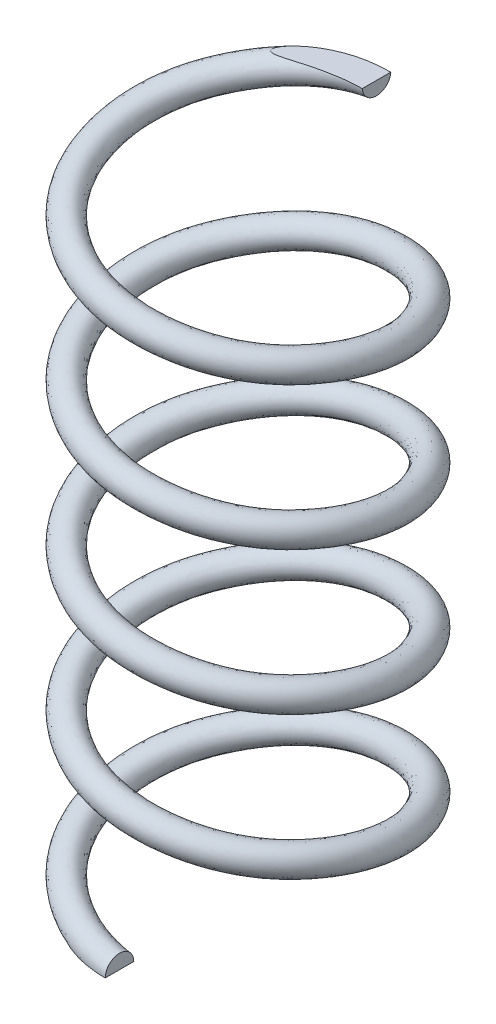
ISO-10303-21;
HEADER;
FILE_DESCRIPTION(('STEP AP214'),'2;1');
FILE_NAME('part.step','',(''),(''),'','','');
FILE_SCHEMA(('AUTOMOTIVE_DESIGN { 1 0 10303 214 1 1 1 1 }'));
ENDSEC;
DATA;
#1=APPLICATION_CONTEXT('core data for automotive mechanical design processes');
#2=APPLICATION_PROTOCOL_DEFINITION('international standard','automotive_design',2000,#1);
#3=PRODUCT_CONTEXT('',#1,'mechanical');
#4=PRODUCT('Part','Part','',(#3));
#5=PRODUCT_RELATED_PRODUCT_CATEGORY('part','',(#4));
#6=PRODUCT_DEFINITION_FORMATION('','',#4);
#7=PRODUCT_DEFINITION_CONTEXT('part definition',#1,'design');
#8=PRODUCT_DEFINITION('design','',#6,#7);
#9=PRODUCT_DEFINITION_SHAPE('','',#8);
#10=(LENGTH_UNIT() NAMED_UNIT(*) SI_UNIT(.MILLI.,.METRE.));
#11=(NAMED_UNIT(*) PLANE_ANGLE_UNIT() SI_UNIT($,.RADIAN.));
#12=(NAMED_UNIT(*) SI_UNIT($,.STERADIAN.) SOLID_ANGLE_UNIT());
#13=UNCERTAINTY_MEASURE_WITH_UNIT(LENGTH_MEASURE(1.E-05),#10,'distance_accuracy_value','');
#14=(GEOMETRIC_REPRESENTATION_CONTEXT(3) GLOBAL_UNCERTAINTY_ASSIGNED_CONTEXT((#13)) GLOBAL_UNIT_ASSIGNED_CONTEXT((#10,
#11,#12)) REPRESENTATION_CONTEXT('',''));
#15=CARTESIAN_POINT('',(0.,0.,0.));
#16=DIRECTION('',(0.,0.,1.));
#17=DIRECTION('',(1.,0.,0.));
#18=AXIS2_PLACEMENT_3D('',#15,#16,#17);
#19=CARTESIAN_POINT('',(0.,2.25,-0.5));
#20=DIRECTION('',(1.,0.,0.));
#21=DIRECTION('',(0.,0.,-1.));
#22=AXIS2_PLACEMENT_3D('',#19,#20,#21);
#23=PLANE('',#22);
#24=CARTESIAN_POINT('',(0.,2.25,-0.45));
#25=DIRECTION('',(1.,0.,0.));
#26=DIRECTION('',(0.,0.,1.));
#27=AXIS2_PLACEMENT_3D('',#24,#25,#26);
#28=CIRCLE('',#27,0.05);
#29=CARTESIAN_POINT('',(0.,2.24696184895227,-0.400092388975115));
#30=VERTEX_POINT('',#29);
#31=CARTESIAN_POINT('',(0.,2.24696184895227,-0.499907611024885));
#32=VERTEX_POINT('',#31);
#33=EDGE_CURVE('E68',#30,#32,#28,.T.);
#34=ORIENTED_EDGE('',*,*,#33,.T.);
#35=DIRECTION('',(0.,0.,1.));
#36=VECTOR('',#35,1.);
#37=CARTESIAN_POINT('',(0.,2.24696184895227,-0.5));
#38=LINE('',#37,#36);
#39=EDGE_CURVE('E65',#32,#30,#38,.T.);
#40=ORIENTED_EDGE('',*,*,#39,.T.);
#41=EDGE_LOOP('',(#34,#40));
#42=FACE_BOUND('',#41,.T.);
#43=ADVANCED_FACE('F35',(#42),#23,.T.);
#44=CARTESIAN_POINT('',(0.,0.,0.4));
#45=CARTESIAN_POINT('',(-0.23094010767585,0.0416666666666667,0.4));
#46=CARTESIAN_POINT('',(-0.346410161513775,0.0833333333333333,0.2));
#47=CARTESIAN_POINT('',(-0.461880215351701,0.125,0.));
#48=CARTESIAN_POINT('',(-0.346410161513775,0.166666666666667,-0.2));
#49=CARTESIAN_POINT('',(-0.23094010767585,0.208333333333333,-0.4));
#50=CARTESIAN_POINT('',(0.,0.25,-0.4));
#51=CARTESIAN_POINT('',(0.23094010767585,0.291666666666667,-0.4));
#52=CARTESIAN_POINT('',(0.346410161513775,0.333333333333333,-0.2));
#53=CARTESIAN_POINT('',(0.461880215351701,0.375,0.));
#54=CARTESIAN_POINT('',(0.346410161513776,0.416666666666667,0.2));
#55=CARTESIAN_POINT('',(0.23094010767585,0.458333333333333,0.4));
#56=CARTESIAN_POINT('',(0.,0.5,0.4));
#57=CARTESIAN_POINT('',(-0.23094010767585,0.541666666666667,0.4));
#58=CARTESIAN_POINT('',(-0.346410161513775,0.583333333333333,0.2));
#59=CARTESIAN_POINT('',(-0.461880215351701,0.625,0.));
#60=CARTESIAN_POINT('',(-0.346410161513775,0.666666666666667,-0.2));
#61=CARTESIAN_POINT('',(-0.23094010767585,0.708333333333333,-0.4));
#62=CARTESIAN_POINT('',(0.,0.75,-0.4));
#63=CARTESIAN_POINT('',(0.23094010767585,0.791666666666667,-0.4));
#64=CARTESIAN_POINT('',(0.346410161513775,0.833333333333333,-0.2));
#65=CARTESIAN_POINT('',(0.461880215351701,0.875,0.));
#66=CARTESIAN_POINT('',(0.346410161513776,0.916666666666667,0.2));
#67=CARTESIAN_POINT('',(0.23094010767585,0.958333333333333,0.4));
#68=CARTESIAN_POINT('',(0.,1.,0.4));
#69=CARTESIAN_POINT('',(-0.23094010767585,1.04166666666667,0.4));
#70=CARTESIAN_POINT('',(-0.346410161513775,1.08333333333333,0.2));
#71=CARTESIAN_POINT('',(-0.461880215351701,1.125,0.));
#72=CARTESIAN_POINT('',(-0.346410161513775,1.16666666666667,-0.2));
#73=CARTESIAN_POINT('',(-0.23094010767585,1.20833333333333,-0.4));
#74=CARTESIAN_POINT('',(0.,1.25,-0.4));
#75=CARTESIAN_POINT('',(0.23094010767585,1.29166666666667,-0.4));
#76=CARTESIAN_POINT('',(0.346410161513775,1.33333333333333,-0.2));
#77=CARTESIAN_POINT('',(0.461880215351701,1.375,0.));
#78=CARTESIAN_POINT('',(0.346410161513776,1.41666666666667,0.2));
#79=CARTESIAN_POINT('',(0.23094010767585,1.45833333333333,0.4));
#80=CARTESIAN_POINT('',(0.,1.5,0.4));
#81=CARTESIAN_POINT('',(-0.23094010767585,1.54166666666667,0.4));
#82=CARTESIAN_POINT('',(-0.346410161513775,1.58333333333333,0.2));
#83=CARTESIAN_POINT('',(-0.461880215351701,1.625,0.));
#84=CARTESIAN_POINT('',(-0.346410161513775,1.66666666666667,-0.2));
#85=CARTESIAN_POINT('',(-0.23094010767585,1.70833333333333,-0.4));
#86=CARTESIAN_POINT('',(0.,1.75,-0.4));
#87=CARTESIAN_POINT('',(0.23094010767585,1.79166666666667,-0.4));
#88=CARTESIAN_POINT('',(0.346410161513775,1.83333333333333,-0.2));
#89=CARTESIAN_POINT('',(0.461880215351701,1.875,0.));
#90=CARTESIAN_POINT('',(0.346410161513776,1.91666666666667,0.2));
#91=CARTESIAN_POINT('',(0.23094010767585,1.95833333333333,0.4));
#92=CARTESIAN_POINT('',(0.,2.,0.4));
#93=CARTESIAN_POINT('',(-0.23094010767585,2.04166666666667,0.4));
#94=CARTESIAN_POINT('',(-0.346410161513775,2.08333333333333,0.2));
#95=CARTESIAN_POINT('',(-0.461880215351701,2.125,0.));
#96=CARTESIAN_POINT('',(-0.346410161513775,2.16666666666667,-0.2));
#97=CARTESIAN_POINT('',(-0.23094010767585,2.20833333333333,-0.4));
#98=CARTESIAN_POINT('',(0.,2.25,-0.4));
#99=CARTESIAN_POINT('',(0.,0.1,0.4));
#100=CARTESIAN_POINT('',(-0.23094010767585,0.141666666666667,0.4));
#101=CARTESIAN_POINT('',(-0.346410161513775,0.183333333333333,0.2));
#102=CARTESIAN_POINT('',(-0.461880215351701,0.225,0.));
#103=CARTESIAN_POINT('',(-0.346410161513775,0.266666666666667,-0.2));
#104=CARTESIAN_POINT('',(-0.23094010767585,0.308333333333333,-0.4));
#105=CARTESIAN_POINT('',(0.,0.35,-0.4));
#106=CARTESIAN_POINT('',(0.23094010767585,0.391666666666667,-0.4));
#107=CARTESIAN_POINT('',(0.346410161513775,0.433333333333333,-0.2));
#108=CARTESIAN_POINT('',(0.461880215351701,0.475,0.));
#109=CARTESIAN_POINT('',(0.346410161513776,0.516666666666667,0.2));
#110=CARTESIAN_POINT('',(0.230940107675851,0.558333333333333,0.4));
#111=CARTESIAN_POINT('',(0.,0.6,0.4));
#112=CARTESIAN_POINT('',(-0.23094010767585,0.641666666666667,0.4));
#113=CARTESIAN_POINT('',(-0.346410161513775,0.683333333333333,0.2));
#114=CARTESIAN_POINT('',(-0.461880215351701,0.725,0.));
#115=CARTESIAN_POINT('',(-0.346410161513775,0.766666666666667,-0.2));
#116=CARTESIAN_POINT('',(-0.23094010767585,0.808333333333333,-0.4));
#117=CARTESIAN_POINT('',(0.,0.85,-0.4));
#118=CARTESIAN_POINT('',(0.23094010767585,0.891666666666667,-0.4));
#119=CARTESIAN_POINT('',(0.346410161513775,0.933333333333333,-0.2));
#120=CARTESIAN_POINT('',(0.461880215351701,0.975,0.));
#121=CARTESIAN_POINT('',(0.346410161513776,1.01666666666667,0.2));
#122=CARTESIAN_POINT('',(0.230940107675851,1.05833333333333,0.4));
#123=CARTESIAN_POINT('',(0.,1.1,0.4));
#124=CARTESIAN_POINT('',(-0.23094010767585,1.14166666666667,0.4));
#125=CARTESIAN_POINT('',(-0.346410161513775,1.18333333333333,0.2));
#126=CARTESIAN_POINT('',(-0.461880215351701,1.225,0.));
#127=CARTESIAN_POINT('',(-0.346410161513775,1.26666666666667,-0.2));
#128=CARTESIAN_POINT('',(-0.23094010767585,1.30833333333333,-0.4));
#129=CARTESIAN_POINT('',(0.,1.35,-0.4));
#130=CARTESIAN_POINT('',(0.23094010767585,1.39166666666667,-0.4));
#131=CARTESIAN_POINT('',(0.346410161513775,1.43333333333333,-0.2));
#132=CARTESIAN_POINT('',(0.461880215351701,1.475,0.));
#133=CARTESIAN_POINT('',(0.346410161513776,1.51666666666667,0.2));
#134=CARTESIAN_POINT('',(0.230940107675851,1.55833333333333,0.4));
#135=CARTESIAN_POINT('',(0.,1.6,0.4));
#136=CARTESIAN_POINT('',(-0.23094010767585,1.64166666666667,0.4));
#137=CARTESIAN_POINT('',(-0.346410161513775,1.68333333333333,0.2));
#138=CARTESIAN_POINT('',(-0.461880215351701,1.725,0.));
#139=CARTESIAN_POINT('',(-0.346410161513775,1.76666666666667,-0.2));
#140=CARTESIAN_POINT('',(-0.23094010767585,1.80833333333333,-0.4));
#141=CARTESIAN_POINT('',(0.,1.85,-0.4));
#142=CARTESIAN_POINT('',(0.23094010767585,1.89166666666667,-0.4));
#143=CARTESIAN_POINT('',(0.346410161513775,1.93333333333333,-0.2));
#144=CARTESIAN_POINT('',(0.461880215351701,1.975,0.));
#145=CARTESIAN_POINT('',(0.346410161513776,2.01666666666667,0.2));
#146=CARTESIAN_POINT('',(0.230940107675851,2.05833333333333,0.4));
#147=CARTESIAN_POINT('',(0.,2.1,0.4));
#148=CARTESIAN_POINT('',(-0.23094010767585,2.14166666666667,0.4));
#149=CARTESIAN_POINT('',(-0.346410161513775,2.18333333333333,0.2));
#150=CARTESIAN_POINT('',(-0.461880215351701,2.225,0.));
#151=CARTESIAN_POINT('',(-0.346410161513775,2.26666666666667,-0.2));
#152=CARTESIAN_POINT('',(-0.23094010767585,2.30833333333333,-0.4));
#153=CARTESIAN_POINT('',(0.,2.35,-0.4));
#154=CARTESIAN_POINT('',(0.,0.1,0.5));
#155=CARTESIAN_POINT('',(-0.288675134594813,0.141666666666667,0.5));
#156=CARTESIAN_POINT('',(-0.433012701892219,0.183333333333333,0.25));
#157=CARTESIAN_POINT('',(-0.577350269189626,0.225,0.));
#158=CARTESIAN_POINT('',(-0.433012701892219,0.266666666666667,-0.25));
#159=CARTESIAN_POINT('',(-0.288675134594813,0.308333333333333,-0.5));
#160=CARTESIAN_POINT('',(0.,0.35,-0.5));
#161=CARTESIAN_POINT('',(0.288675134594813,0.391666666666667,-0.5));
#162=CARTESIAN_POINT('',(0.433012701892219,0.433333333333333,-0.25));
#163=CARTESIAN_POINT('',(0.577350269189626,0.475,0.));
#164=CARTESIAN_POINT('',(0.43301270189222,0.516666666666667,0.25));
#165=CARTESIAN_POINT('',(0.288675134594813,0.558333333333333,0.5));
#166=CARTESIAN_POINT('',(0.,0.6,0.5));
#167=CARTESIAN_POINT('',(-0.288675134594813,0.641666666666667,0.5));
#168=CARTESIAN_POINT('',(-0.433012701892219,0.683333333333333,0.25));
#169=CARTESIAN_POINT('',(-0.577350269189626,0.725,0.));
#170=CARTESIAN_POINT('',(-0.433012701892219,0.766666666666667,-0.25));
#171=CARTESIAN_POINT('',(-0.288675134594813,0.808333333333333,-0.5));
#172=CARTESIAN_POINT('',(0.,0.85,-0.5));
#173=CARTESIAN_POINT('',(0.288675134594813,0.891666666666667,-0.5));
#174=CARTESIAN_POINT('',(0.433012701892219,0.933333333333333,-0.25));
#175=CARTESIAN_POINT('',(0.577350269189626,0.975,0.));
#176=CARTESIAN_POINT('',(0.43301270189222,1.01666666666667,0.25));
#177=CARTESIAN_POINT('',(0.288675134594813,1.05833333333333,0.5));
#178=CARTESIAN_POINT('',(0.,1.1,0.5));
#179=CARTESIAN_POINT('',(-0.288675134594813,1.14166666666667,0.5));
#180=CARTESIAN_POINT('',(-0.433012701892219,1.18333333333333,0.25));
#181=CARTESIAN_POINT('',(-0.577350269189626,1.225,0.));
#182=CARTESIAN_POINT('',(-0.433012701892219,1.26666666666667,-0.25));
#183=CARTESIAN_POINT('',(-0.288675134594813,1.30833333333333,-0.5));
#184=CARTESIAN_POINT('',(0.,1.35,-0.5));
#185=CARTESIAN_POINT('',(0.288675134594813,1.39166666666667,-0.5));
#186=CARTESIAN_POINT('',(0.433012701892219,1.43333333333333,-0.25));
#187=CARTESIAN_POINT('',(0.577350269189626,1.475,0.));
#188=CARTESIAN_POINT('',(0.43301270189222,1.51666666666667,0.25));
#189=CARTESIAN_POINT('',(0.288675134594813,1.55833333333333,0.5));
#190=CARTESIAN_POINT('',(0.,1.6,0.5));
#191=CARTESIAN_POINT('',(-0.288675134594813,1.64166666666667,0.5));
#192=CARTESIAN_POINT('',(-0.433012701892219,1.68333333333333,0.25));
#193=CARTESIAN_POINT('',(-0.577350269189626,1.725,0.));
#194=CARTESIAN_POINT('',(-0.433012701892219,1.76666666666667,-0.25));
#195=CARTESIAN_POINT('',(-0.288675134594813,1.80833333333333,-0.5));
#196=CARTESIAN_POINT('',(0.,1.85,-0.5));
#197=CARTESIAN_POINT('',(0.288675134594813,1.89166666666667,-0.5));
#198=CARTESIAN_POINT('',(0.433012701892219,1.93333333333333,-0.25));
#199=CARTESIAN_POINT('',(0.577350269189626,1.975,0.));
#200=CARTESIAN_POINT('',(0.43301270189222,2.01666666666667,0.25));
#201=CARTESIAN_POINT('',(0.288675134594813,2.05833333333333,0.5));
#202=CARTESIAN_POINT('',(0.,2.1,0.5));
#203=CARTESIAN_POINT('',(-0.288675134594813,2.14166666666667,0.5));
#204=CARTESIAN_POINT('',(-0.433012701892219,2.18333333333333,0.25));
#205=CARTESIAN_POINT('',(-0.577350269189626,2.225,0.));
#206=CARTESIAN_POINT('',(-0.433012701892219,2.26666666666667,-0.25));
#207=CARTESIAN_POINT('',(-0.288675134594813,2.30833333333333,-0.5));
#208=CARTESIAN_POINT('',(0.,2.35,-0.5));
#209=CARTESIAN_POINT('',(0.,0.,0.5));
#210=CARTESIAN_POINT('',(-0.288675134594813,0.0416666666666667,0.5));
#211=CARTESIAN_POINT('',(-0.433012701892219,0.0833333333333333,0.25));
#212=CARTESIAN_POINT('',(-0.577350269189626,0.125,0.));
#213=CARTESIAN_POINT('',(-0.433012701892219,0.166666666666667,-0.25));
#214=CARTESIAN_POINT('',(-0.288675134594813,0.208333333333333,-0.5));
#215=CARTESIAN_POINT('',(0.,0.25,-0.5));
#216=CARTESIAN_POINT('',(0.288675134594813,0.291666666666667,-0.5));
#217=CARTESIAN_POINT('',(0.433012701892219,0.333333333333333,-0.25));
#218=CARTESIAN_POINT('',(0.577350269189626,0.375,0.));
#219=CARTESIAN_POINT('',(0.43301270189222,0.416666666666667,0.25));
#220=CARTESIAN_POINT('',(0.288675134594813,0.458333333333333,0.5));
#221=CARTESIAN_POINT('',(0.,0.5,0.5));
#222=CARTESIAN_POINT('',(-0.288675134594813,0.541666666666667,0.5));
#223=CARTESIAN_POINT('',(-0.433012701892219,0.583333333333333,0.25));
#224=CARTESIAN_POINT('',(-0.577350269189626,0.625,0.));
#225=CARTESIAN_POINT('',(-0.433012701892219,0.666666666666667,-0.25));
#226=CARTESIAN_POINT('',(-0.288675134594813,0.708333333333333,-0.5));
#227=CARTESIAN_POINT('',(0.,0.75,-0.5));
#228=CARTESIAN_POINT('',(0.288675134594813,0.791666666666667,-0.5));
#229=CARTESIAN_POINT('',(0.433012701892219,0.833333333333333,-0.25));
#230=CARTESIAN_POINT('',(0.577350269189626,0.875,0.));
#231=CARTESIAN_POINT('',(0.43301270189222,0.916666666666667,0.25));
#232=CARTESIAN_POINT('',(0.288675134594813,0.958333333333333,0.5));
#233=CARTESIAN_POINT('',(0.,1.,0.5));
#234=CARTESIAN_POINT('',(-0.288675134594813,1.04166666666667,0.5));
#235=CARTESIAN_POINT('',(-0.433012701892219,1.08333333333333,0.25));
#236=CARTESIAN_POINT('',(-0.577350269189626,1.125,0.));
#237=CARTESIAN_POINT('',(-0.433012701892219,1.16666666666667,-0.25));
#238=CARTESIAN_POINT('',(-0.288675134594813,1.20833333333333,-0.5));
#239=CARTESIAN_POINT('',(0.,1.25,-0.5));
#240=CARTESIAN_POINT('',(0.288675134594813,1.29166666666667,-0.5));
#241=CARTESIAN_POINT('',(0.433012701892219,1.33333333333333,-0.25));
#242=CARTESIAN_POINT('',(0.577350269189626,1.375,0.));
#243=CARTESIAN_POINT('',(0.43301270189222,1.41666666666667,0.25));
#244=CARTESIAN_POINT('',(0.288675134594813,1.45833333333333,0.5));
#245=CARTESIAN_POINT('',(0.,1.5,0.5));
#246=CARTESIAN_POINT('',(-0.288675134594813,1.54166666666667,0.5));
#247=CARTESIAN_POINT('',(-0.433012701892219,1.58333333333333,0.25));
#248=CARTESIAN_POINT('',(-0.577350269189626,1.625,0.));
#249=CARTESIAN_POINT('',(-0.433012701892219,1.66666666666667,-0.25));
#250=CARTESIAN_POINT('',(-0.288675134594813,1.70833333333333,-0.5));
#251=CARTESIAN_POINT('',(0.,1.75,-0.5));
#252=CARTESIAN_POINT('',(0.288675134594813,1.79166666666667,-0.5));
#253=CARTESIAN_POINT('',(0.433012701892219,1.83333333333333,-0.25));
#254=CARTESIAN_POINT('',(0.577350269189626,1.875,0.));
#255=CARTESIAN_POINT('',(0.43301270189222,1.91666666666667,0.25));
#256=CARTESIAN_POINT('',(0.288675134594813,1.95833333333333,0.5));
#257=CARTESIAN_POINT('',(0.,2.,0.5));
#258=CARTESIAN_POINT('',(-0.288675134594813,2.04166666666667,0.5));
#259=CARTESIAN_POINT('',(-0.433012701892219,2.08333333333333,0.25));
#260=CARTESIAN_POINT('',(-0.577350269189626,2.125,0.));
#261=CARTESIAN_POINT('',(-0.433012701892219,2.16666666666667,-0.25));
#262=CARTESIAN_POINT('',(-0.288675134594813,2.20833333333333,-0.5));
#263=CARTESIAN_POINT('',(0.,2.25,-0.5));
#264=CARTESIAN_POINT('',(0.,-0.1,0.5));
#265=CARTESIAN_POINT('',(-0.288675134594813,-0.0583333333333333,0.5));
#266=CARTESIAN_POINT('',(-0.433012701892219,-0.0166666666666667,0.25));
#267=CARTESIAN_POINT('',(-0.577350269189626,0.025,0.));
#268=CARTESIAN_POINT('',(-0.433012701892219,0.0666666666666667,-0.25));
#269=CARTESIAN_POINT('',(-0.288675134594813,0.108333333333333,-0.5));
#270=CARTESIAN_POINT('',(0.,0.15,-0.5));
#271=CARTESIAN_POINT('',(0.288675134594813,0.191666666666667,-0.5));
#272=CARTESIAN_POINT('',(0.433012701892219,0.233333333333333,-0.25));
#273=CARTESIAN_POINT('',(0.577350269189626,0.275,0.));
#274=CARTESIAN_POINT('',(0.43301270189222,0.316666666666667,0.25));
#275=CARTESIAN_POINT('',(0.288675134594813,0.358333333333333,0.5));
#276=CARTESIAN_POINT('',(0.,0.4,0.5));
#277=CARTESIAN_POINT('',(-0.288675134594813,0.441666666666667,0.5));
#278=CARTESIAN_POINT('',(-0.433012701892219,0.483333333333333,0.25));
#279=CARTESIAN_POINT('',(-0.577350269189626,0.525,0.));
#280=CARTESIAN_POINT('',(-0.433012701892219,0.566666666666667,-0.25));
#281=CARTESIAN_POINT('',(-0.288675134594813,0.608333333333333,-0.5));
#282=CARTESIAN_POINT('',(0.,0.65,-0.5));
#283=CARTESIAN_POINT('',(0.288675134594813,0.691666666666667,-0.5));
#284=CARTESIAN_POINT('',(0.433012701892219,0.733333333333333,-0.25));
#285=CARTESIAN_POINT('',(0.577350269189626,0.775,0.));
#286=CARTESIAN_POINT('',(0.43301270189222,0.816666666666667,0.25));
#287=CARTESIAN_POINT('',(0.288675134594813,0.858333333333333,0.5));
#288=CARTESIAN_POINT('',(0.,0.9,0.5));
#289=CARTESIAN_POINT('',(-0.288675134594813,0.941666666666667,0.5));
#290=CARTESIAN_POINT('',(-0.433012701892219,0.983333333333333,0.25));
#291=CARTESIAN_POINT('',(-0.577350269189626,1.025,0.));
#292=CARTESIAN_POINT('',(-0.433012701892219,1.06666666666667,-0.25));
#293=CARTESIAN_POINT('',(-0.288675134594813,1.10833333333333,-0.5));
#294=CARTESIAN_POINT('',(0.,1.15,-0.5));
#295=CARTESIAN_POINT('',(0.288675134594813,1.19166666666667,-0.5));
#296=CARTESIAN_POINT('',(0.433012701892219,1.23333333333333,-0.25));
#297=CARTESIAN_POINT('',(0.577350269189626,1.275,0.));
#298=CARTESIAN_POINT('',(0.43301270189222,1.31666666666667,0.25));
#299=CARTESIAN_POINT('',(0.288675134594813,1.35833333333333,0.5));
#300=CARTESIAN_POINT('',(0.,1.4,0.5));
#301=CARTESIAN_POINT('',(-0.288675134594813,1.44166666666667,0.5));
#302=CARTESIAN_POINT('',(-0.433012701892219,1.48333333333333,0.25));
#303=CARTESIAN_POINT('',(-0.577350269189626,1.525,0.));
#304=CARTESIAN_POINT('',(-0.433012701892219,1.56666666666667,-0.25));
#305=CARTESIAN_POINT('',(-0.288675134594813,1.60833333333333,-0.5));
#306=CARTESIAN_POINT('',(0.,1.65,-0.5));
#307=CARTESIAN_POINT('',(0.288675134594813,1.69166666666667,-0.5));
#308=CARTESIAN_POINT('',(0.433012701892219,1.73333333333333,-0.25));
#309=CARTESIAN_POINT('',(0.577350269189626,1.775,0.));
#310=CARTESIAN_POINT('',(0.43301270189222,1.81666666666667,0.25));
#311=CARTESIAN_POINT('',(0.288675134594813,1.85833333333333,0.5));
#312=CARTESIAN_POINT('',(0.,1.9,0.5));
#313=CARTESIAN_POINT('',(-0.288675134594813,1.94166666666667,0.5));
#314=CARTESIAN_POINT('',(-0.433012701892219,1.98333333333333,0.25));
#315=CARTESIAN_POINT('',(-0.577350269189626,2.025,0.));
#316=CARTESIAN_POINT('',(-0.433012701892219,2.06666666666667,-0.25));
#317=CARTESIAN_POINT('',(-0.288675134594813,2.10833333333333,-0.5));
#318=CARTESIAN_POINT('',(0.,2.15,-0.5));
#319=CARTESIAN_POINT('',(0.,-0.1,0.4));
#320=CARTESIAN_POINT('',(-0.23094010767585,-0.0583333333333333,0.4));
#321=CARTESIAN_POINT('',(-0.346410161513775,-0.0166666666666667,0.2));
#322=CARTESIAN_POINT('',(-0.461880215351701,0.025,0.));
#323=CARTESIAN_POINT('',(-0.346410161513775,0.0666666666666667,-0.2));
#324=CARTESIAN_POINT('',(-0.23094010767585,0.108333333333333,-0.4));
#325=CARTESIAN_POINT('',(0.,0.15,-0.4));
#326=CARTESIAN_POINT('',(0.23094010767585,0.191666666666667,-0.4));
#327=CARTESIAN_POINT('',(0.346410161513775,0.233333333333333,-0.2));
#328=CARTESIAN_POINT('',(0.461880215351701,0.275,0.));
#329=CARTESIAN_POINT('',(0.346410161513776,0.316666666666667,0.2));
#330=CARTESIAN_POINT('',(0.230940107675851,0.358333333333333,0.4));
#331=CARTESIAN_POINT('',(0.,0.4,0.4));
#332=CARTESIAN_POINT('',(-0.23094010767585,0.441666666666667,0.4));
#333=CARTESIAN_POINT('',(-0.346410161513775,0.483333333333333,0.2));
#334=CARTESIAN_POINT('',(-0.461880215351701,0.525,0.));
#335=CARTESIAN_POINT('',(-0.346410161513775,0.566666666666667,-0.2));
#336=CARTESIAN_POINT('',(-0.23094010767585,0.608333333333333,-0.4));
#337=CARTESIAN_POINT('',(0.,0.65,-0.4));
#338=CARTESIAN_POINT('',(0.23094010767585,0.691666666666667,-0.4));
#339=CARTESIAN_POINT('',(0.346410161513775,0.733333333333333,-0.2));
#340=CARTESIAN_POINT('',(0.461880215351701,0.775,0.));
#341=CARTESIAN_POINT('',(0.346410161513776,0.816666666666667,0.2));
#342=CARTESIAN_POINT('',(0.230940107675851,0.858333333333333,0.4));
#343=CARTESIAN_POINT('',(0.,0.9,0.4));
#344=CARTESIAN_POINT('',(-0.23094010767585,0.941666666666667,0.4));
#345=CARTESIAN_POINT('',(-0.346410161513775,0.983333333333333,0.2));
#346=CARTESIAN_POINT('',(-0.461880215351701,1.025,0.));
#347=CARTESIAN_POINT('',(-0.346410161513775,1.06666666666667,-0.2));
#348=CARTESIAN_POINT('',(-0.23094010767585,1.10833333333333,-0.4));
#349=CARTESIAN_POINT('',(0.,1.15,-0.4));
#350=CARTESIAN_POINT('',(0.23094010767585,1.19166666666667,-0.4));
#351=CARTESIAN_POINT('',(0.346410161513775,1.23333333333333,-0.2));
#352=CARTESIAN_POINT('',(0.461880215351701,1.275,0.));
#353=CARTESIAN_POINT('',(0.346410161513776,1.31666666666667,0.2));
#354=CARTESIAN_POINT('',(0.230940107675851,1.35833333333333,0.4));
#355=CARTESIAN_POINT('',(0.,1.4,0.4));
#356=CARTESIAN_POINT('',(-0.23094010767585,1.44166666666667,0.4));
#357=CARTESIAN_POINT('',(-0.346410161513775,1.48333333333333,0.2));
#358=CARTESIAN_POINT('',(-0.461880215351701,1.525,0.));
#359=CARTESIAN_POINT('',(-0.346410161513775,1.56666666666667,-0.2));
#360=CARTESIAN_POINT('',(-0.23094010767585,1.60833333333333,-0.4));
#361=CARTESIAN_POINT('',(0.,1.65,-0.4));
#362=CARTESIAN_POINT('',(0.23094010767585,1.69166666666667,-0.4));
#363=CARTESIAN_POINT('',(0.346410161513775,1.73333333333333,-0.2));
#364=CARTESIAN_POINT('',(0.461880215351701,1.775,0.));
#365=CARTESIAN_POINT('',(0.346410161513776,1.81666666666667,0.2));
#366=CARTESIAN_POINT('',(0.230940107675851,1.85833333333333,0.4));
#367=CARTESIAN_POINT('',(0.,1.9,0.4));
#368=CARTESIAN_POINT('',(-0.23094010767585,1.94166666666667,0.4));
#369=CARTESIAN_POINT('',(-0.346410161513775,1.98333333333333,0.2));
#370=CARTESIAN_POINT('',(-0.461880215351701,2.025,0.));
#371=CARTESIAN_POINT('',(-0.346410161513775,2.06666666666667,-0.2));
#372=CARTESIAN_POINT('',(-0.23094010767585,2.10833333333333,-0.4));
#373=CARTESIAN_POINT('',(0.,2.15,-0.4));
#374=CARTESIAN_POINT('',(0.,0.,0.4));
#375=CARTESIAN_POINT('',(-0.23094010767585,0.0416666666666667,0.4));
#376=CARTESIAN_POINT('',(-0.346410161513775,0.0833333333333333,0.2));
#377=CARTESIAN_POINT('',(-0.461880215351701,0.125,0.));
#378=CARTESIAN_POINT('',(-0.346410161513775,0.166666666666667,-0.2));
#379=CARTESIAN_POINT('',(-0.23094010767585,0.208333333333333,-0.4));
#380=CARTESIAN_POINT('',(0.,0.25,-0.4));
#381=CARTESIAN_POINT('',(0.23094010767585,0.291666666666667,-0.4));
#382=CARTESIAN_POINT('',(0.346410161513775,0.333333333333333,-0.2));
#383=CARTESIAN_POINT('',(0.461880215351701,0.375,0.));
#384=CARTESIAN_POINT('',(0.346410161513776,0.416666666666667,0.2));
#385=CARTESIAN_POINT('',(0.23094010767585,0.458333333333333,0.4));
#386=CARTESIAN_POINT('',(0.,0.5,0.4));
#387=CARTESIAN_POINT('',(-0.23094010767585,0.541666666666667,0.4));
#388=CARTESIAN_POINT('',(-0.346410161513775,0.583333333333333,0.2));
#389=CARTESIAN_POINT('',(-0.461880215351701,0.625,0.));
#390=CARTESIAN_POINT('',(-0.346410161513775,0.666666666666667,-0.2));
#391=CARTESIAN_POINT('',(-0.23094010767585,0.708333333333333,-0.4));
#392=CARTESIAN_POINT('',(0.,0.75,-0.4));
#393=CARTESIAN_POINT('',(0.23094010767585,0.791666666666667,-0.4));
#394=CARTESIAN_POINT('',(0.346410161513775,0.833333333333333,-0.2));
#395=CARTESIAN_POINT('',(0.461880215351701,0.875,0.));
#396=CARTESIAN_POINT('',(0.346410161513776,0.916666666666667,0.2));
#397=CARTESIAN_POINT('',(0.23094010767585,0.958333333333333,0.4));
#398=CARTESIAN_POINT('',(0.,1.,0.4));
#399=CARTESIAN_POINT('',(-0.23094010767585,1.04166666666667,0.4));
#400=CARTESIAN_POINT('',(-0.346410161513775,1.08333333333333,0.2));
#401=CARTESIAN_POINT('',(-0.461880215351701,1.125,0.));
#402=CARTESIAN_POINT('',(-0.346410161513775,1.16666666666667,-0.2));
#403=CARTESIAN_POINT('',(-0.23094010767585,1.20833333333333,-0.4));
#404=CARTESIAN_POINT('',(0.,1.25,-0.4));
#405=CARTESIAN_POINT('',(0.23094010767585,1.29166666666667,-0.4));
#406=CARTESIAN_POINT('',(0.346410161513775,1.33333333333333,-0.2));
#407=CARTESIAN_POINT('',(0.461880215351701,1.375,0.));
#408=CARTESIAN_POINT('',(0.346410161513776,1.41666666666667,0.2));
#409=CARTESIAN_POINT('',(0.23094010767585,1.45833333333333,0.4));
#410=CARTESIAN_POINT('',(0.,1.5,0.4));
#411=CARTESIAN_POINT('',(-0.23094010767585,1.54166666666667,0.4));
#412=CARTESIAN_POINT('',(-0.346410161513775,1.58333333333333,0.2));
#413=CARTESIAN_POINT('',(-0.461880215351701,1.625,0.));
#414=CARTESIAN_POINT('',(-0.346410161513775,1.66666666666667,-0.2));
#415=CARTESIAN_POINT('',(-0.23094010767585,1.70833333333333,-0.4));
#416=CARTESIAN_POINT('',(0.,1.75,-0.4));
#417=CARTESIAN_POINT('',(0.23094010767585,1.79166666666667,-0.4));
#418=CARTESIAN_POINT('',(0.346410161513775,1.83333333333333,-0.2));
#419=CARTESIAN_POINT('',(0.461880215351701,1.875,0.));
#420=CARTESIAN_POINT('',(0.346410161513776,1.91666666666667,0.2));
#421=CARTESIAN_POINT('',(0.23094010767585,1.95833333333333,0.4));
#422=CARTESIAN_POINT('',(0.,2.,0.4));
#423=CARTESIAN_POINT('',(-0.23094010767585,2.04166666666667,0.4));
#424=CARTESIAN_POINT('',(-0.346410161513775,2.08333333333333,0.2));
#425=CARTESIAN_POINT('',(-0.461880215351701,2.125,0.));
#426=CARTESIAN_POINT('',(-0.346410161513775,2.16666666666667,-0.2));
#427=CARTESIAN_POINT('',(-0.23094010767585,2.20833333333333,-0.4));
#428=CARTESIAN_POINT('',(0.,2.25,-0.4));
#429=(BOUNDED_SURFACE() B_SPLINE_SURFACE(3,2,((#44,#45,#46,#47,#48,#49,#50,#51,#52,#53,#54,#55,
#56,#57,#58,#59,#60,#61,#62,#63,#64,#65,#66,#67,#68,#69,#70,#71,#72,#73,#74,#75,#76,#77,#78,#79,
#80,#81,#82,#83,#84,#85,#86,#87,#88,#89,#90,#91,#92,#93,#94,#95,#96,#97,#98),(#99,#100,#101,
#102,#103,#104,#105,#106,#107,#108,#109,#110,#111,#112,#113,#114,#115,#116,#117,#118,#119,#120,
#121,#122,#123,#124,#125,#126,#127,#128,#129,#130,#131,#132,#133,#134,#135,#136,#137,#138,#139,
#140,#141,#142,#143,#144,#145,#146,#147,#148,#149,#150,#151,#152,#153),(#154,#155,#156,#157,
#158,#159,#160,#161,#162,#163,#164,#165,#166,#167,#168,#169,#170,#171,#172,#173,#174,#175,#176,
#177,#178,#179,#180,#181,#182,#183,#184,#185,#186,#187,#188,#189,#190,#191,#192,#193,#194,#195,
#196,#197,#198,#199,#200,#201,#202,#203,#204,#205,#206,#207,#208),(#209,#210,#211,#212,#213,
#214,#215,#216,#217,#218,#219,#220,#221,#222,#223,#224,#225,#226,#227,#228,#229,#230,#231,#232,
#233,#234,#235,#236,#237,#238,#239,#240,#241,#242,#243,#244,#245,#246,#247,#248,#249,#250,#251,
#252,#253,#254,#255,#256,#257,#258,#259,#260,#261,#262,#263),(#264,#265,#266,#267,#268,#269,
#270,#271,#272,#273,#274,#275,#276,#277,#278,#279,#280,#281,#282,#283,#284,#285,#286,#287,#288,
#289,#290,#291,#292,#293,#294,#295,#296,#297,#298,#299,#300,#301,#302,#303,#304,#305,#306,#307,
#308,#309,#310,#311,#312,#313,#314,#315,#316,#317,#318),(#319,#320,#321,#322,#323,#324,#325,
#326,#327,#328,#329,#330,#331,#332,#333,#334,#335,#336,#337,#338,#339,#340,#341,#342,#343,#344,
#345,#346,#347,#348,#349,#350,#351,#352,#353,#354,#355,#356,#357,#358,#359,#360,#361,#362,#363,
#364,#365,#366,#367,#368,#369,#370,#371,#372,#373),(#374,#375,#376,#377,#378,#379,#380,#381,
#382,#383,#384,#385,#386,#387,#388,#389,#390,#391,#392,#393,#394,#395,#396,#397,#398,#399,#400,
#401,#402,#403,#404,#405,#406,#407,#408,#409,#410,#411,#412,#413,#414,#415,#416,#417,#418,#419,
#420,#421,#422,#423,#424,#425,#426,#427,#428)),.UNSPECIFIED.,.T.,.F.,
.F.) B_SPLINE_SURFACE_WITH_KNOTS((4,3,4),(3,2,2,2,2,2,2,2,2,2,2,2,2,2,2,2,2,2,2,2,2,2,2,2,2,2,2,
3),(0.,0.5,1.),(0.,0.0333333333333333,0.0666666666666667,0.1,0.133333333333333,
0.166666666666667,0.2,0.233333333333333,0.266666666666667,0.3,0.333333333333333,
0.366666666666667,0.4,0.433333333333333,0.466666666666667,0.5,0.533333333333333,
0.566666666666667,0.6,0.633333333333333,0.666666666666667,0.7,0.733333333333333,
0.766666666666667,0.8,0.833333333333333,0.866666666666667,0.9),
.UNSPECIFIED.) GEOMETRIC_REPRESENTATION_ITEM() RATIONAL_B_SPLINE_SURFACE(((1.,0.866025403784439,
1.,0.866025403784439,1.,0.866025403784439,1.,0.866025403784439,1.,0.866025403784439,1.,
0.866025403784439,1.,0.866025403784439,1.,0.866025403784439,1.,0.866025403784439,1.,
0.866025403784439,1.,0.866025403784439,1.,0.866025403784439,1.,0.866025403784439,1.,
0.866025403784439,1.,0.866025403784439,1.,0.866025403784439,1.,0.866025403784439,1.,
0.866025403784439,1.,0.866025403784439,1.,0.866025403784439,1.,0.866025403784439,1.,
0.866025403784439,1.,0.866025403784439,1.,0.866025403784439,1.,0.866025403784439,1.,
0.866025403784439,1.,0.866025403784439,1.),(0.333333333333333,0.288675134594813,
0.333333333333333,0.288675134594813,0.333333333333333,0.288675134594813,0.333333333333333,
0.288675134594813,0.333333333333333,0.288675134594813,0.333333333333333,0.288675134594813,
0.333333333333333,0.288675134594813,0.333333333333333,0.288675134594813,0.333333333333333,
0.288675134594813,0.333333333333333,0.288675134594813,0.333333333333333,0.288675134594813,
0.333333333333333,0.288675134594813,0.333333333333333,0.288675134594813,0.333333333333333,
0.288675134594813,0.333333333333333,0.288675134594813,0.333333333333333,0.288675134594813,
0.333333333333333,0.288675134594813,0.333333333333333,0.288675134594813,0.333333333333333,
0.288675134594813,0.333333333333333,0.288675134594813,0.333333333333333,0.288675134594813,
0.333333333333333,0.288675134594813,0.333333333333333,0.288675134594813,0.333333333333333,
0.288675134594813,0.333333333333333,0.288675134594813,0.333333333333333,0.288675134594813,
0.333333333333333,0.288675134594813,0.333333333333333),(0.333333333333333,0.288675134594813,
0.333333333333333,0.288675134594813,0.333333333333333,0.288675134594813,0.333333333333333,
0.288675134594813,0.333333333333333,0.288675134594813,0.333333333333333,0.288675134594813,
0.333333333333333,0.288675134594813,0.333333333333333,0.288675134594813,0.333333333333333,
0.288675134594813,0.333333333333333,0.288675134594813,0.333333333333333,0.288675134594813,
0.333333333333333,0.288675134594813,0.333333333333333,0.288675134594813,0.333333333333333,
0.288675134594813,0.333333333333333,0.288675134594813,0.333333333333333,0.288675134594813,
0.333333333333333,0.288675134594813,0.333333333333333,0.288675134594813,0.333333333333333,
0.288675134594813,0.333333333333333,0.288675134594813,0.333333333333333,0.288675134594813,
0.333333333333333,0.288675134594813,0.333333333333333,0.288675134594813,0.333333333333333,
0.288675134594813,0.333333333333333,0.288675134594813,0.333333333333333,0.288675134594813,
0.333333333333333,0.288675134594813,0.333333333333333),(1.,0.866025403784439,1.,
0.866025403784439,1.,0.866025403784439,1.,0.866025403784439,1.,0.866025403784439,1.,
0.866025403784439,1.,0.866025403784439,1.,0.866025403784439,1.,0.866025403784439,1.,
0.866025403784439,1.,0.866025403784439,1.,0.866025403784439,1.,0.866025403784439,1.,
0.866025403784439,1.,0.866025403784439,1.,0.866025403784439,1.,0.866025403784439,1.,
0.866025403784439,1.,0.866025403784439,1.,0.866025403784439,1.,0.866025403784439,1.,
0.866025403784439,1.,0.866025403784439,1.,0.866025403784439,1.,0.866025403784439,1.,
0.866025403784439,1.,0.866025403784439,1.),(0.333333333333333,0.288675134594813,
0.333333333333333,0.288675134594813,0.333333333333333,0.288675134594813,0.333333333333333,
0.288675134594813,0.333333333333333,0.288675134594813,0.333333333333333,0.288675134594813,
0.333333333333333,0.288675134594813,0.333333333333333,0.288675134594813,0.333333333333333,
0.288675134594813,0.333333333333333,0.288675134594813,0.333333333333333,0.288675134594813,
0.333333333333333,0.288675134594813,0.333333333333333,0.288675134594813,0.333333333333333,
0.288675134594813,0.333333333333333,0.288675134594813,0.333333333333333,0.288675134594813,
0.333333333333333,0.288675134594813,0.333333333333333,0.288675134594813,0.333333333333333,
0.288675134594813,0.333333333333333,0.288675134594813,0.333333333333333,0.288675134594813,
0.333333333333333,0.288675134594813,0.333333333333333,0.288675134594813,0.333333333333333,
0.288675134594813,0.333333333333333,0.288675134594813,0.333333333333333,0.288675134594813,
0.333333333333333,0.288675134594813,0.333333333333333),(0.333333333333333,0.288675134594813,
0.333333333333333,0.288675134594813,0.333333333333333,0.288675134594813,0.333333333333333,
0.288675134594813,0.333333333333333,0.288675134594813,0.333333333333333,0.288675134594813,
0.333333333333333,0.288675134594813,0.333333333333333,0.288675134594813,0.333333333333333,
0.288675134594813,0.333333333333333,0.288675134594813,0.333333333333333,0.288675134594813,
0.333333333333333,0.288675134594813,0.333333333333333,0.288675134594813,0.333333333333333,
0.288675134594813,0.333333333333333,0.288675134594813,0.333333333333333,0.288675134594813,
0.333333333333333,0.288675134594813,0.333333333333333,0.288675134594813,0.333333333333333,
0.288675134594813,0.333333333333333,0.288675134594813,0.333333333333333,0.288675134594813,
0.333333333333333,0.288675134594813,0.333333333333333,0.288675134594813,0.333333333333333,
0.288675134594813,0.333333333333333,0.288675134594813,0.333333333333333,0.288675134594813,
0.333333333333333,0.288675134594813,0.333333333333333),(1.,0.866025403784439,1.,
0.866025403784439,1.,0.866025403784439,1.,0.866025403784439,1.,0.866025403784439,1.,
0.866025403784439,1.,0.866025403784439,1.,0.866025403784439,1.,0.866025403784439,1.,
0.866025403784439,1.,0.866025403784439,1.,0.866025403784439,1.,0.866025403784439,1.,
0.866025403784439,1.,0.866025403784439,1.,0.866025403784439,1.,0.866025403784439,1.,
0.866025403784439,1.,0.866025403784439,1.,0.866025403784439,1.,0.866025403784439,1.,
0.866025403784439,1.,0.866025403784439,1.,0.866025403784439,1.,0.866025403784439,1.,
0.866025403784439,1.,0.866025403784439,1.))) REPRESENTATION_ITEM('') SURFACE());
#430=CARTESIAN_POINT('',(0.,0.,0.45));
#431=DIRECTION('',(1.,0.,0.));
#432=DIRECTION('',(0.,0.,-1.));
#433=AXIS2_PLACEMENT_3D('',#430,#431,#432);
#434=CIRCLE('',#433,0.05);
#435=CARTESIAN_POINT('',(0.,0.,0.4));
#436=VERTEX_POINT('',#435);
#437=CARTESIAN_POINT('',(0.,0.,0.5));
#438=VERTEX_POINT('',#437);
#439=EDGE_CURVE('E64',#436,#438,#434,.T.);
#440=CARTESIAN_POINT('',(0.,0.,0.4));
#441=CARTESIAN_POINT('',(-0.0161637221567576,0.,0.400007106315342));
#442=CARTESIAN_POINT('',(-0.032313951359052,0.,0.399275435526951));
#443=CARTESIAN_POINT('',(-0.064431524406634,0.,0.396503856682461));
#444=CARTESIAN_POINT('',(-0.080399362097674,0.,0.394469778765157));
#445=CARTESIAN_POINT('',(-0.115244930763529,0.,0.388750465172293));
#446=CARTESIAN_POINT('',(-0.134081106939697,0.,0.38482013411514));
#447=CARTESIAN_POINT('',(-0.162133995713875,0.,0.378174042943383));
#448=CARTESIAN_POINT('',(-0.171446983042541,0.,0.375834880072536));
#449=CARTESIAN_POINT('',(-0.19005126225444,0.,0.37106882751509));
#450=CARTESIAN_POINT('',(-0.199342557642659,2.68023617903311E-13,0.368641953221074));
#451=CARTESIAN_POINT('',(-0.213837851290101,-1.48356649112879E-13,0.365127894867246));
#452=CARTESIAN_POINT('',(-0.219015510445959,-4.38597277431438E-13,0.363926166506231));
#453=CARTESIAN_POINT('',(-0.229423631484913,4.37242428620571E-13,0.361792404221895));
#454=CARTESIAN_POINT('',(-0.234653880851351,1.59882688462557E-12,0.360859548666203));
#455=CARTESIAN_POINT('',(-0.242616650624278,-7.47673161887997E-13,0.360052523702651));
#456=CARTESIAN_POINT('',(-0.245318915779181,-2.24872386516369E-12,0.359883667371978));
#457=CARTESIAN_POINT('',(-0.250707962881899,2.21451205277624E-12,0.359956895478122));
#458=CARTESIAN_POINT('',(-0.253394354917361,8.06556937293719E-12,0.360192766995742));
#459=CARTESIAN_POINT('',(-0.257295329658761,3.80799535518233E-13,0.361285799680792));
#460=CARTESIAN_POINT('',(-0.258592824526843,-5.14071790339683E-12,0.361786896900496));
#461=CARTESIAN_POINT('',(-0.260756764732083,4.25371206407925E-12,0.363082942247956));
#462=CARTESIAN_POINT('',(-0.261658956791215,1.58076719875733E-11,0.363812269555439));
#463=CARTESIAN_POINT('',(-0.263135971241375,1.71456875664377E-11,0.365561765877107));
#464=CARTESIAN_POINT('',(-0.263709209994126,6.82553646437321E-12,0.36658330692788));
#465=CARTESIAN_POINT('',(-0.264532519554389,-3.21010011040619E-12,0.368915748510739));
#466=CARTESIAN_POINT('',(-0.264718840165633,-1.03703245352964E-12,0.370246963345866));
#467=CARTESIAN_POINT('',(-0.264773814281389,1.78434393309775E-12,0.373754057702714));
#468=CARTESIAN_POINT('',(-0.264359549882816,5.41187471182027E-13,0.375920131131607));
#469=CARTESIAN_POINT('',(-0.262929867589866,-7.20362999389791E-13,0.380801805932603));
#470=CARTESIAN_POINT('',(-0.261760824413789,-1.96966858332314E-13,0.383461900809066));
#471=CARTESIAN_POINT('',(-0.259070130000368,1.98143506562567E-13,0.388607808503036));
#472=CARTESIAN_POINT('',(-0.257546414058712,0.,0.391092485257509));
#473=CARTESIAN_POINT('',(-0.253556183597528,0.,0.396983095675571));
#474=CARTESIAN_POINT('',(-0.250971626634059,0.,0.400307682076466));
#475=CARTESIAN_POINT('',(-0.245519194653528,0.,0.406718558708913));
#476=CARTESIAN_POINT('',(-0.242650842205501,0.,0.409804431264497));
#477=CARTESIAN_POINT('',(-0.23373802138137,0.,0.418757217250507));
#478=CARTESIAN_POINT('',(-0.227386964250089,0.,0.424317743591987));
#479=CARTESIAN_POINT('',(-0.208102685733011,0.,0.439561371085288));
#480=CARTESIAN_POINT('',(-0.194470968813249,0.,0.448352908584374));
#481=CARTESIAN_POINT('',(-0.166051354440555,0.,0.463806806869086));
#482=CARTESIAN_POINT('',(-0.151261074282545,0.,0.470464628351624));
#483=CARTESIAN_POINT('',(-0.114320882747019,0.,0.484191545391644));
#484=CARTESIAN_POINT('',(-0.0917670097206958,0.,0.490180904172025));
#485=CARTESIAN_POINT('',(-0.0461147318962809,0.,0.498071505980008));
#486=CARTESIAN_POINT('',(-0.023021418671631,0.,0.500001881017153));
#487=CARTESIAN_POINT('',(0.,0.,0.5));
#488=B_SPLINE_CURVE_WITH_KNOTS('',3,(#440,#441,#442,#443,#444,#445,#446,#447,#448,#449,#450,
#451,#452,#453,#454,#455,#456,#457,#458,#459,#460,#461,#462,#463,#464,#465,#466,#467,#468,#469,
#470,#471,#472,#473,#474,#475,#476,#477,#478,#479,#480,#481,#482,#483,#484,#485,#486,#487),
.UNSPECIFIED.,.F.,.F.,(4,2,2,2,2,2,2,2,2,2,2,2,2,2,2,2,2,2,2,2,2,2,2,4),(0.,0.0484546243421199,
0.0966938469539711,0.154365923672736,0.183174375282175,0.211977795579045,0.227927445770706,
0.243827826699405,0.251946958873977,0.259942567555509,0.264067309395717,0.267480349770178,
0.270909686168748,0.274869796538945,0.281387786293689,0.29006384275875,0.298791728585215,
0.311398637024211,0.324027126912594,0.349289897304463,0.39770273188867,0.446217887386323,
0.515826446261889,0.584933683239415),.UNSPECIFIED.);
#489=EDGE_CURVE('E48',#436,#438,#488,.T.);
#490=CARTESIAN_POINT('',(0.,2.24696184895227,-0.499907611024885));
#491=CARTESIAN_POINT('',(-0.032408111031513,2.24696184897014,-0.500176831552469));
#492=CARTESIAN_POINT('',(-0.0648729188008498,2.24696184896775,-0.496664171512527));
#493=CARTESIAN_POINT('',(-0.116260003689261,2.24696184895872,-0.484504643086969));
#494=CARTESIAN_POINT('',(-0.135765109304949,2.24696184895397,-0.478226071384263));
#495=CARTESIAN_POINT('',(-0.173431807190815,2.24696184895058,-0.462468130824105));
#496=CARTESIAN_POINT('',(-0.191597010559516,2.24696184895193,-0.452997779141333));
#497=CARTESIAN_POINT('',(-0.21684359136997,2.24696184895242,-0.436447865350405));
#498=CARTESIAN_POINT('',(-0.224793332532827,2.24696184895234,-0.430669939654784));
#499=CARTESIAN_POINT('',(-0.239994647189748,2.24696184895221,-0.418251287960419));
#500=CARTESIAN_POINT('',(-0.247247281777862,2.24696184895216,-0.411611910612207));
#501=CARTESIAN_POINT('',(-0.257291463463809,2.24696184895233,-0.400868234809433));
#502=CARTESIAN_POINT('',(-0.260501663320265,2.24696184895242,-0.397154376623535));
#503=CARTESIAN_POINT('',(-0.26651763235632,2.24696184895213,-0.389416543538879));
#504=CARTESIAN_POINT('',(-0.269324545171388,2.24696184895174,-0.385393497307645));
#505=CARTESIAN_POINT('',(-0.272999334331511,2.24696184895252,-0.379023813735812));
#506=CARTESIAN_POINT('',(-0.274137221994132,2.24696184895301,-0.376838703647667));
#507=CARTESIAN_POINT('',(-0.276118093313636,2.24696184895154,-0.372344634162143));
#508=CARTESIAN_POINT('',(-0.276961303216426,2.24696184894957,-0.370035771356794));
#509=CARTESIAN_POINT('',(-0.278116592637014,2.24696184895489,-0.365212982529165));
#510=CARTESIAN_POINT('',(-0.278426547322957,2.24696184896221,-0.362698277769965));
#511=CARTESIAN_POINT('',(-0.277897905781826,2.24696184894771,-0.359128931695463));
#512=CARTESIAN_POINT('',(-0.277590020906375,2.24696184893951,-0.35802050030162));
#513=CARTESIAN_POINT('',(-0.276589601421124,2.24696184893984,-0.355972645233388));
#514=CARTESIAN_POINT('',(-0.275894631591096,2.24696184894847,-0.355034341909764));
#515=CARTESIAN_POINT('',(-0.274295311215685,2.2469618489543,-0.353542169528759));
#516=CARTESIAN_POINT('',(-0.273414293457277,2.24696184895244,-0.35296205310144));
#517=CARTESIAN_POINT('',(-0.270879548093542,2.2469618489501,-0.351696837016143));
#518=CARTESIAN_POINT('',(-0.269124401870507,2.24696184895161,-0.351234240474857));
#519=CARTESIAN_POINT('',(-0.264926640625994,2.24696184895319,-0.350566745497715));
#520=CARTESIAN_POINT('',(-0.262469836037077,2.24696184895253,-0.350520421115666));
#521=CARTESIAN_POINT('',(-0.257558532819164,2.24696184895202,-0.350736208595044));
#522=CARTESIAN_POINT('',(-0.255104220625457,2.24696184895217,-0.351000869614371));
#523=CARTESIAN_POINT('',(-0.247275918667054,2.24696184895246,-0.352116609913447));
#524=CARTESIAN_POINT('',(-0.241952448872573,2.24696184895232,-0.353289942180869));
#525=CARTESIAN_POINT('',(-0.231369052660617,2.24696184895222,-0.355898011836316));
#526=CARTESIAN_POINT('',(-0.226109300203632,2.24696184895226,-0.35733334322982));
#527=CARTESIAN_POINT('',(-0.215630514150405,2.24696184895229,-0.36030260326258));
#528=CARTESIAN_POINT('',(-0.210411411204088,2.24696184895228,-0.361836273274597));
#529=CARTESIAN_POINT('',(-0.199982736699822,2.24696184895227,-0.364914827864433));
#530=CARTESIAN_POINT('',(-0.194773160808332,2.24696184895226,-0.36645970009169));
#531=CARTESIAN_POINT('',(-0.179417935498055,2.24696184895226,-0.37095464088305));
#532=CARTESIAN_POINT('',(-0.169256822901292,2.24696184895227,-0.373853983787353));
#533=CARTESIAN_POINT('',(-0.148841636121752,2.24696184895228,-0.379318844478266));
#534=CARTESIAN_POINT('',(-0.138587544939679,2.24696184895227,-0.381884299847854));
#535=CARTESIAN_POINT('',(-0.117984350747284,2.24696184895227,-0.386578191532213));
#536=CARTESIAN_POINT('',(-0.10763530021726,2.24696184895227,-0.388706855641818));
#537=CARTESIAN_POINT('',(-0.0865660359738516,2.24696184895227,-0.392510638570209));
#538=CARTESIAN_POINT('',(-0.0758433196091533,2.24696184895227,-0.394172038280544));
#539=CARTESIAN_POINT('',(-0.0543096939753363,2.24696184895227,-0.396911606233443));
#540=CARTESIAN_POINT('',(-0.0434986950428159,2.24696184895227,-0.397989079030567));
#541=CARTESIAN_POINT('',(-0.0217939001163142,2.24696184895227,-0.39952153055325));
#542=CARTESIAN_POINT('',(-0.0108999461635867,2.24696184895227,-0.399974254352497));
#543=CARTESIAN_POINT('',(0.,2.24696184895227,-0.400092388975115));
#544=B_SPLINE_CURVE_WITH_KNOTS('',3,(#490,#491,#492,#493,#494,#495,#496,#497,#498,#499,#500,
#501,#502,#503,#504,#505,#506,#507,#508,#509,#510,#511,#512,#513,#514,#515,#516,#517,#518,#519,
#520,#521,#522,#523,#524,#525,#526,#527,#528,#529,#530,#531,#532,#533,#534,#535,#536,#537,#538,
#539,#540,#541,#542,#543),.UNSPECIFIED.,.F.,.F.,(4,2,2,2,2,2,2,2,2,2,2,2,2,2,2,2,2,2,2,2,2,2,2,
2,2,2,4),(0.,0.0969598918639235,0.158198238243724,0.219265009032461,0.248707894604884,
0.278105229670398,0.292817262519886,0.307486714961176,0.314859302968114,0.322226217993588,
0.329622420140624,0.33301670248764,0.336432584075551,0.339552769982929,0.344908173515296,
0.352244150564679,0.359640682781447,0.375962388347506,0.392321568847828,0.408639362353341,
0.424941293795816,0.456638067601171,0.488340758324512,0.520026873241616,0.552564140632353,
0.585140074579023,0.617833281040644),.UNSPECIFIED.);
#545=EDGE_CURVE('E42',#32,#30,#544,.T.);
#546=ORIENTED_EDGE('',*,*,#439,.F.);
#547=ORIENTED_EDGE('',*,*,#489,.T.);
#548=EDGE_LOOP('',(#546,#547));
#549=FACE_BOUND('',#548,.T.);
#550=ORIENTED_EDGE('',*,*,#545,.F.);
#551=ORIENTED_EDGE('',*,*,#33,.F.);
#552=EDGE_LOOP('',(#550,#551));
#553=FACE_BOUND('',#552,.T.);
#554=ADVANCED_FACE('F63',(#549,#553),#429,.F.);
#555=CARTESIAN_POINT('',(0.,0.,0.5));
#556=DIRECTION('',(-1.,0.,0.));
#557=DIRECTION('',(0.,0.,1.));
#558=AXIS2_PLACEMENT_3D('',#555,#556,#557);
#559=PLANE('',#558);
#560=ORIENTED_EDGE('',*,*,#439,.T.);
#561=DIRECTION('',(0.,0.,-1.));
#562=VECTOR('',#561,1.);
#563=CARTESIAN_POINT('',(0.,0.,0.5));
#564=LINE('',#563,#562);
#565=EDGE_CURVE('E12',#438,#436,#564,.T.);
#566=ORIENTED_EDGE('',*,*,#565,.T.);
#567=EDGE_LOOP('',(#560,#566));
#568=FACE_BOUND('',#567,.T.);
#569=ADVANCED_FACE('F67',(#568),#559,.F.);
#570=CARTESIAN_POINT('',(0.,2.24696184895227,0.));
#571=DIRECTION('',(0.,1.,0.));
#572=DIRECTION('',(0.,0.,1.));
#573=AXIS2_PLACEMENT_3D('',#570,#571,#572);
#574=PLANE('',#573);
#575=ORIENTED_EDGE('',*,*,#39,.F.);
#576=ORIENTED_EDGE('',*,*,#545,.T.);
#577=EDGE_LOOP('',(#575,#576));
#578=FACE_BOUND('',#577,.T.);
#579=ADVANCED_FACE('F82',(#578),#574,.T.);
#580=CARTESIAN_POINT('',(0.,0.,0.));
#581=DIRECTION('',(0.,1.,0.));
#582=DIRECTION('',(0.,0.,1.));
#583=AXIS2_PLACEMENT_3D('',#580,#581,#582);
#584=PLANE('',#583);
#585=ORIENTED_EDGE('',*,*,#489,.F.);
#586=ORIENTED_EDGE('',*,*,#565,.F.);
#587=EDGE_LOOP('',(#585,#586));
#588=FACE_BOUND('',#587,.T.);
#589=ADVANCED_FACE('F58',(#588),#584,.F.);
#590=CLOSED_SHELL('',(#43,#554,#569,#579,#589));
#591=MANIFOLD_SOLID_BREP('B2',#590);
#592=ADVANCED_BREP_SHAPE_REPRESENTATION('',(#18,#591),#14);
#593=SHAPE_DEFINITION_REPRESENTATION(#9,#592);
ENDSEC;
END-ISO-10303-21;
